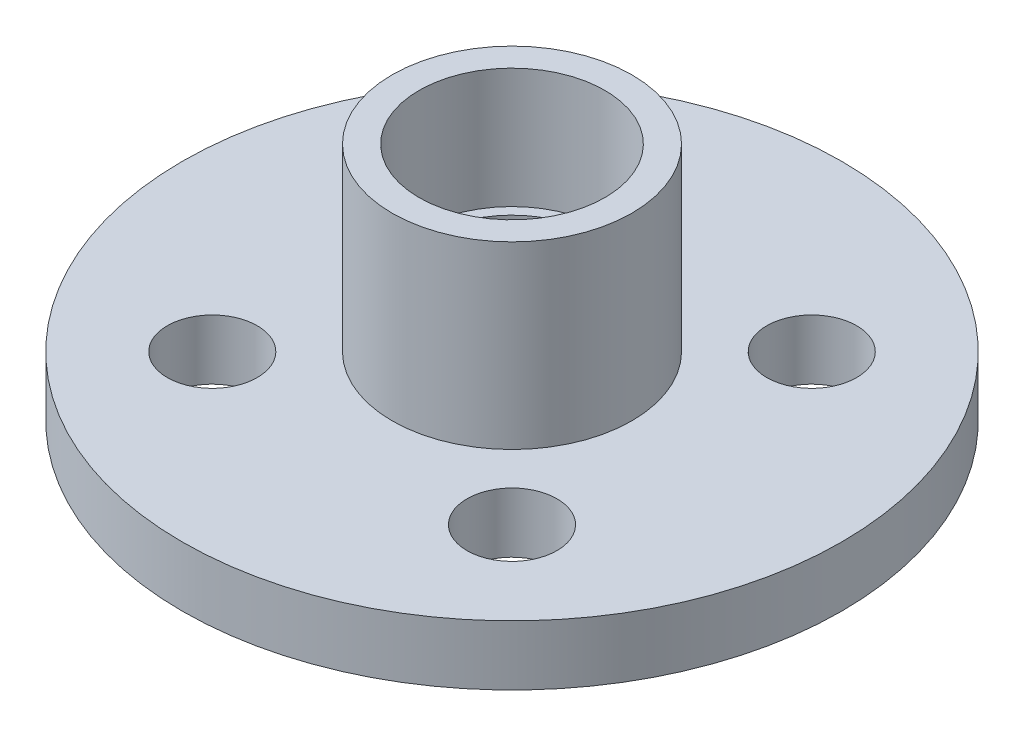
ISO-10303-21;
HEADER;
FILE_DESCRIPTION(('STEP AP214'),'2;1');
FILE_NAME('part.step','',(''),(''),'','','');
FILE_SCHEMA(('AUTOMOTIVE_DESIGN { 1 0 10303 214 1 1 1 1 }'));
ENDSEC;
DATA;
#1=APPLICATION_CONTEXT('core data for automotive mechanical design processes');
#2=APPLICATION_PROTOCOL_DEFINITION('international standard','automotive_design',2000,#1);
#3=PRODUCT_CONTEXT('',#1,'mechanical');
#4=PRODUCT('Part','Part','',(#3));
#5=PRODUCT_RELATED_PRODUCT_CATEGORY('part','',(#4));
#6=PRODUCT_DEFINITION_FORMATION('','',#4);
#7=PRODUCT_DEFINITION_CONTEXT('part definition',#1,'design');
#8=PRODUCT_DEFINITION('design','',#6,#7);
#9=PRODUCT_DEFINITION_SHAPE('','',#8);
#10=(LENGTH_UNIT() NAMED_UNIT(*) SI_UNIT(.MILLI.,.METRE.));
#11=(NAMED_UNIT(*) PLANE_ANGLE_UNIT() SI_UNIT($,.RADIAN.));
#12=(NAMED_UNIT(*) SI_UNIT($,.STERADIAN.) SOLID_ANGLE_UNIT());
#13=UNCERTAINTY_MEASURE_WITH_UNIT(LENGTH_MEASURE(1.E-05),#10,'distance_accuracy_value','');
#14=(GEOMETRIC_REPRESENTATION_CONTEXT(3) GLOBAL_UNCERTAINTY_ASSIGNED_CONTEXT((#13)) GLOBAL_UNIT_ASSIGNED_CONTEXT((#10,
#11,#12)) REPRESENTATION_CONTEXT('',''));
#15=CARTESIAN_POINT('',(0.,0.,0.));
#16=DIRECTION('',(0.,0.,1.));
#17=DIRECTION('',(1.,0.,0.));
#18=AXIS2_PLACEMENT_3D('',#15,#16,#17);
#19=CARTESIAN_POINT('',(0.,2.,0.));
#20=DIRECTION('',(0.,-1.,0.));
#21=DIRECTION('',(0.,0.,-1.));
#22=AXIS2_PLACEMENT_3D('',#19,#20,#21);
#23=CYLINDRICAL_SURFACE('',#22,1.5);
#24=CARTESIAN_POINT('',(0.,0.,0.));
#25=DIRECTION('',(0.,1.,0.));
#26=DIRECTION('',(0.,0.,1.));
#27=AXIS2_PLACEMENT_3D('',#24,#25,#26);
#28=CIRCLE('',#27,1.5);
#29=CARTESIAN_POINT('',(0.,0.,1.5));
#30=VERTEX_POINT('',#29);
#31=EDGE_CURVE('E71',#30,#30,#28,.T.);
#32=ORIENTED_EDGE('',*,*,#31,.F.);
#33=EDGE_LOOP('',(#32));
#34=FACE_BOUND('',#33,.T.);
#35=CARTESIAN_POINT('',(0.,1.,0.));
#36=DIRECTION('',(0.,1.,0.));
#37=DIRECTION('',(0.,0.,1.));
#38=AXIS2_PLACEMENT_3D('',#35,#36,#37);
#39=CIRCLE('',#38,1.5);
#40=CARTESIAN_POINT('',(0.,1.,1.5));
#41=VERTEX_POINT('',#40);
#42=EDGE_CURVE('E45',#41,#41,#39,.T.);
#43=ORIENTED_EDGE('',*,*,#42,.T.);
#44=EDGE_LOOP('',(#43));
#45=FACE_BOUND('',#44,.T.);
#46=ADVANCED_FACE('F41',(#34,#45),#23,.F.);
#47=CARTESIAN_POINT('',(-5.,2.,-5.));
#48=DIRECTION('',(0.,-1.,0.));
#49=DIRECTION('',(0.,0.,-1.));
#50=AXIS2_PLACEMENT_3D('',#47,#48,#49);
#51=CYLINDRICAL_SURFACE('',#50,1.5);
#52=CARTESIAN_POINT('',(-5.,2.,-5.));
#53=DIRECTION('',(0.,1.,0.));
#54=DIRECTION('',(0.,0.,1.));
#55=AXIS2_PLACEMENT_3D('',#52,#53,#54);
#56=CIRCLE('',#55,1.5);
#57=CARTESIAN_POINT('',(-5.,2.,-3.5));
#58=VERTEX_POINT('',#57);
#59=EDGE_CURVE('E49',#58,#58,#56,.T.);
#60=ORIENTED_EDGE('',*,*,#59,.T.);
#61=EDGE_LOOP('',(#60));
#62=FACE_BOUND('',#61,.T.);
#63=CARTESIAN_POINT('',(-5.,0.,-5.));
#64=DIRECTION('',(0.,1.,0.));
#65=DIRECTION('',(0.,0.,1.));
#66=AXIS2_PLACEMENT_3D('',#63,#64,#65);
#67=CIRCLE('',#66,1.5);
#68=CARTESIAN_POINT('',(-5.,0.,-3.5));
#69=VERTEX_POINT('',#68);
#70=EDGE_CURVE('E68',#69,#69,#67,.T.);
#71=ORIENTED_EDGE('',*,*,#70,.F.);
#72=EDGE_LOOP('',(#71));
#73=FACE_BOUND('',#72,.T.);
#74=ADVANCED_FACE('F103',(#62,#73),#51,.F.);
#75=CARTESIAN_POINT('',(-5.00000000000005,2.,4.99999999999995));
#76=DIRECTION('',(0.,-1.,0.));
#77=DIRECTION('',(0.,0.,-1.));
#78=AXIS2_PLACEMENT_3D('',#75,#76,#77);
#79=CYLINDRICAL_SURFACE('',#78,1.5);
#80=CARTESIAN_POINT('',(-5.00000000000005,2.,4.99999999999995));
#81=DIRECTION('',(0.,1.,0.));
#82=DIRECTION('',(0.,0.,1.));
#83=AXIS2_PLACEMENT_3D('',#80,#81,#82);
#84=CIRCLE('',#83,1.5);
#85=CARTESIAN_POINT('',(-5.00000000000005,2.,6.49999999999995));
#86=VERTEX_POINT('',#85);
#87=EDGE_CURVE('E54',#86,#86,#84,.T.);
#88=ORIENTED_EDGE('',*,*,#87,.T.);
#89=EDGE_LOOP('',(#88));
#90=FACE_BOUND('',#89,.T.);
#91=CARTESIAN_POINT('',(-5.00000000000005,0.,4.99999999999995));
#92=DIRECTION('',(0.,1.,0.));
#93=DIRECTION('',(0.,0.,1.));
#94=AXIS2_PLACEMENT_3D('',#91,#92,#93);
#95=CIRCLE('',#94,1.5);
#96=CARTESIAN_POINT('',(-5.00000000000005,0.,6.49999999999995));
#97=VERTEX_POINT('',#96);
#98=EDGE_CURVE('E65',#97,#97,#95,.T.);
#99=ORIENTED_EDGE('',*,*,#98,.F.);
#100=EDGE_LOOP('',(#99));
#101=FACE_BOUND('',#100,.T.);
#102=ADVANCED_FACE('F91',(#90,#101),#79,.F.);
#103=CARTESIAN_POINT('',(5.00000000000002,2.,-4.99999999999998));
#104=DIRECTION('',(0.,-1.,0.));
#105=DIRECTION('',(0.,0.,-1.));
#106=AXIS2_PLACEMENT_3D('',#103,#104,#105);
#107=CYLINDRICAL_SURFACE('',#106,1.5);
#108=CARTESIAN_POINT('',(5.00000000000002,2.,-4.99999999999998));
#109=DIRECTION('',(0.,1.,0.));
#110=DIRECTION('',(0.,0.,1.));
#111=AXIS2_PLACEMENT_3D('',#108,#109,#110);
#112=CIRCLE('',#111,1.5);
#113=CARTESIAN_POINT('',(5.00000000000002,2.,-3.49999999999998));
#114=VERTEX_POINT('',#113);
#115=EDGE_CURVE('E79',#114,#114,#112,.T.);
#116=ORIENTED_EDGE('',*,*,#115,.T.);
#117=EDGE_LOOP('',(#116));
#118=FACE_BOUND('',#117,.T.);
#119=CARTESIAN_POINT('',(5.00000000000002,0.,-4.99999999999998));
#120=DIRECTION('',(0.,1.,0.));
#121=DIRECTION('',(0.,0.,1.));
#122=AXIS2_PLACEMENT_3D('',#119,#120,#121);
#123=CIRCLE('',#122,1.5);
#124=CARTESIAN_POINT('',(5.00000000000002,0.,-3.49999999999998));
#125=VERTEX_POINT('',#124);
#126=EDGE_CURVE('E61',#125,#125,#123,.T.);
#127=ORIENTED_EDGE('',*,*,#126,.F.);
#128=EDGE_LOOP('',(#127));
#129=FACE_BOUND('',#128,.T.);
#130=ADVANCED_FACE('F148',(#118,#129),#107,.F.);
#131=CARTESIAN_POINT('',(4.99999999999997,2.,5.00000000000003));
#132=DIRECTION('',(0.,-1.,0.));
#133=DIRECTION('',(0.,0.,-1.));
#134=AXIS2_PLACEMENT_3D('',#131,#132,#133);
#135=CYLINDRICAL_SURFACE('',#134,1.5);
#136=CARTESIAN_POINT('',(4.99999999999997,2.,5.00000000000003));
#137=DIRECTION('',(0.,1.,0.));
#138=DIRECTION('',(0.,0.,1.));
#139=AXIS2_PLACEMENT_3D('',#136,#137,#138);
#140=CIRCLE('',#139,1.5);
#141=CARTESIAN_POINT('',(4.99999999999997,2.,6.50000000000003));
#142=VERTEX_POINT('',#141);
#143=EDGE_CURVE('E75',#142,#142,#140,.T.);
#144=ORIENTED_EDGE('',*,*,#143,.T.);
#145=EDGE_LOOP('',(#144));
#146=FACE_BOUND('',#145,.T.);
#147=CARTESIAN_POINT('',(4.99999999999997,0.,5.00000000000003));
#148=DIRECTION('',(0.,1.,0.));
#149=DIRECTION('',(0.,0.,1.));
#150=AXIS2_PLACEMENT_3D('',#147,#148,#149);
#151=CIRCLE('',#150,1.5);
#152=CARTESIAN_POINT('',(4.99999999999997,0.,6.50000000000003));
#153=VERTEX_POINT('',#152);
#154=EDGE_CURVE('E58',#153,#153,#151,.T.);
#155=ORIENTED_EDGE('',*,*,#154,.F.);
#156=EDGE_LOOP('',(#155));
#157=FACE_BOUND('',#156,.T.);
#158=ADVANCED_FACE('F43',(#146,#157),#135,.F.);
#159=CARTESIAN_POINT('',(0.,2.,0.));
#160=DIRECTION('',(0.,-1.,0.));
#161=DIRECTION('',(0.,0.,-1.));
#162=AXIS2_PLACEMENT_3D('',#159,#160,#161);
#163=CYLINDRICAL_SURFACE('',#162,11.);
#164=CARTESIAN_POINT('',(0.,2.,0.));
#165=DIRECTION('',(0.,1.,0.));
#166=DIRECTION('',(0.,0.,1.));
#167=AXIS2_PLACEMENT_3D('',#164,#165,#166);
#168=CIRCLE('',#167,11.);
#169=CARTESIAN_POINT('',(0.,2.,11.));
#170=VERTEX_POINT('',#169);
#171=EDGE_CURVE('E10',#170,#170,#168,.T.);
#172=ORIENTED_EDGE('',*,*,#171,.F.);
#173=EDGE_LOOP('',(#172));
#174=FACE_BOUND('',#173,.T.);
#175=CARTESIAN_POINT('',(0.,0.,0.));
#176=DIRECTION('',(0.,1.,0.));
#177=DIRECTION('',(0.,0.,1.));
#178=AXIS2_PLACEMENT_3D('',#175,#176,#177);
#179=CIRCLE('',#178,11.);
#180=CARTESIAN_POINT('',(0.,0.,11.));
#181=VERTEX_POINT('',#180);
#182=EDGE_CURVE('E73',#181,#181,#179,.T.);
#183=ORIENTED_EDGE('',*,*,#182,.T.);
#184=EDGE_LOOP('',(#183));
#185=FACE_BOUND('',#184,.T.);
#186=ADVANCED_FACE('F98',(#174,#185),#163,.T.);
#187=CARTESIAN_POINT('',(0.,2.,0.));
#188=DIRECTION('',(0.,1.,0.));
#189=DIRECTION('',(0.,0.,1.));
#190=AXIS2_PLACEMENT_3D('',#187,#188,#189);
#191=PLANE('',#190);
#192=CARTESIAN_POINT('',(0.,2.,0.));
#193=DIRECTION('',(0.,1.,0.));
#194=DIRECTION('',(0.,0.,1.));
#195=AXIS2_PLACEMENT_3D('',#192,#193,#194);
#196=CIRCLE('',#195,4.);
#197=CARTESIAN_POINT('',(0.,2.,4.));
#198=VERTEX_POINT('',#197);
#199=EDGE_CURVE('E86',#198,#198,#196,.T.);
#200=ORIENTED_EDGE('',*,*,#199,.F.);
#201=EDGE_LOOP('',(#200));
#202=FACE_BOUND('',#201,.T.);
#203=ORIENTED_EDGE('',*,*,#143,.F.);
#204=EDGE_LOOP('',(#203));
#205=FACE_BOUND('',#204,.T.);
#206=ORIENTED_EDGE('',*,*,#115,.F.);
#207=EDGE_LOOP('',(#206));
#208=FACE_BOUND('',#207,.T.);
#209=ORIENTED_EDGE('',*,*,#87,.F.);
#210=EDGE_LOOP('',(#209));
#211=FACE_BOUND('',#210,.T.);
#212=ORIENTED_EDGE('',*,*,#59,.F.);
#213=EDGE_LOOP('',(#212));
#214=FACE_BOUND('',#213,.T.);
#215=ORIENTED_EDGE('',*,*,#171,.T.);
#216=EDGE_LOOP('',(#215));
#217=FACE_BOUND('',#216,.T.);
#218=ADVANCED_FACE('F94',(#202,#205,#208,#211,#214,#217),#191,.T.);
#219=CARTESIAN_POINT('',(0.,0.,0.));
#220=DIRECTION('',(0.,1.,0.));
#221=DIRECTION('',(0.,0.,1.));
#222=AXIS2_PLACEMENT_3D('',#219,#220,#221);
#223=PLANE('',#222);
#224=ORIENTED_EDGE('',*,*,#154,.T.);
#225=EDGE_LOOP('',(#224));
#226=FACE_BOUND('',#225,.T.);
#227=ORIENTED_EDGE('',*,*,#126,.T.);
#228=EDGE_LOOP('',(#227));
#229=FACE_BOUND('',#228,.T.);
#230=ORIENTED_EDGE('',*,*,#98,.T.);
#231=EDGE_LOOP('',(#230));
#232=FACE_BOUND('',#231,.T.);
#233=ORIENTED_EDGE('',*,*,#70,.T.);
#234=EDGE_LOOP('',(#233));
#235=FACE_BOUND('',#234,.T.);
#236=ORIENTED_EDGE('',*,*,#31,.T.);
#237=EDGE_LOOP('',(#236));
#238=FACE_BOUND('',#237,.T.);
#239=ORIENTED_EDGE('',*,*,#182,.F.);
#240=EDGE_LOOP('',(#239));
#241=FACE_BOUND('',#240,.T.);
#242=ADVANCED_FACE('F97',(#226,#229,#232,#235,#238,#241),#223,.F.);
#243=CARTESIAN_POINT('',(0.,8.,0.));
#244=DIRECTION('',(0.,1.,0.));
#245=DIRECTION('',(0.,0.,1.));
#246=AXIS2_PLACEMENT_3D('',#243,#244,#245);
#247=PLANE('',#246);
#248=CARTESIAN_POINT('',(0.,8.,0.));
#249=DIRECTION('',(0.,1.,0.));
#250=DIRECTION('',(0.,0.,1.));
#251=AXIS2_PLACEMENT_3D('',#248,#249,#250);
#252=CIRCLE('',#251,3.1);
#253=CARTESIAN_POINT('',(0.,8.,3.1));
#254=VERTEX_POINT('',#253);
#255=EDGE_CURVE('E123',#254,#254,#252,.T.);
#256=ORIENTED_EDGE('',*,*,#255,.F.);
#257=EDGE_LOOP('',(#256));
#258=FACE_BOUND('',#257,.T.);
#259=CARTESIAN_POINT('',(0.,8.,0.));
#260=DIRECTION('',(0.,1.,0.));
#261=DIRECTION('',(0.,0.,1.));
#262=AXIS2_PLACEMENT_3D('',#259,#260,#261);
#263=CIRCLE('',#262,4.);
#264=CARTESIAN_POINT('',(0.,8.,4.));
#265=VERTEX_POINT('',#264);
#266=EDGE_CURVE('E62',#265,#265,#263,.T.);
#267=ORIENTED_EDGE('',*,*,#266,.T.);
#268=EDGE_LOOP('',(#267));
#269=FACE_BOUND('',#268,.T.);
#270=ADVANCED_FACE('F111',(#258,#269),#247,.T.);
#271=CARTESIAN_POINT('',(0.,8.,0.));
#272=DIRECTION('',(0.,-1.,0.));
#273=DIRECTION('',(0.,0.,-1.));
#274=AXIS2_PLACEMENT_3D('',#271,#272,#273);
#275=CYLINDRICAL_SURFACE('',#274,4.);
#276=ORIENTED_EDGE('',*,*,#266,.F.);
#277=EDGE_LOOP('',(#276));
#278=FACE_BOUND('',#277,.T.);
#279=ORIENTED_EDGE('',*,*,#199,.T.);
#280=EDGE_LOOP('',(#279));
#281=FACE_BOUND('',#280,.T.);
#282=ADVANCED_FACE('F143',(#278,#281),#275,.T.);
#283=CARTESIAN_POINT('',(0.,4.,0.));
#284=DIRECTION('',(0.,1.,0.));
#285=DIRECTION('',(0.,0.,1.));
#286=AXIS2_PLACEMENT_3D('',#283,#284,#285);
#287=CYLINDRICAL_SURFACE('',#286,3.1);
#288=CARTESIAN_POINT('',(0.,4.,0.));
#289=DIRECTION('',(0.,1.,0.));
#290=DIRECTION('',(0.,0.,1.));
#291=AXIS2_PLACEMENT_3D('',#288,#289,#290);
#292=CIRCLE('',#291,3.1);
#293=CARTESIAN_POINT('',(0.,4.,3.1));
#294=VERTEX_POINT('',#293);
#295=EDGE_CURVE('E126',#294,#294,#292,.T.);
#296=ORIENTED_EDGE('',*,*,#295,.F.);
#297=EDGE_LOOP('',(#296));
#298=FACE_BOUND('',#297,.T.);
#299=ORIENTED_EDGE('',*,*,#255,.T.);
#300=EDGE_LOOP('',(#299));
#301=FACE_BOUND('',#300,.T.);
#302=ADVANCED_FACE('F165',(#298,#301),#287,.F.);
#303=CARTESIAN_POINT('',(0.,4.,0.));
#304=DIRECTION('',(0.,1.,0.));
#305=DIRECTION('',(0.,0.,1.));
#306=AXIS2_PLACEMENT_3D('',#303,#304,#305);
#307=PLANE('',#306);
#308=CARTESIAN_POINT('',(0.,4.,0.));
#309=DIRECTION('',(0.,1.,0.));
#310=DIRECTION('',(0.,0.,1.));
#311=AXIS2_PLACEMENT_3D('',#308,#309,#310);
#312=CIRCLE('',#311,2.75);
#313=CARTESIAN_POINT('',(0.,4.,2.75));
#314=VERTEX_POINT('',#313);
#315=EDGE_CURVE('E129',#314,#314,#312,.T.);
#316=ORIENTED_EDGE('',*,*,#315,.F.);
#317=EDGE_LOOP('',(#316));
#318=FACE_BOUND('',#317,.T.);
#319=ORIENTED_EDGE('',*,*,#295,.T.);
#320=EDGE_LOOP('',(#319));
#321=FACE_BOUND('',#320,.T.);
#322=ADVANCED_FACE('F172',(#318,#321),#307,.T.);
#323=CARTESIAN_POINT('',(0.,1.,0.));
#324=DIRECTION('',(0.,1.,0.));
#325=DIRECTION('',(0.,0.,1.));
#326=AXIS2_PLACEMENT_3D('',#323,#324,#325);
#327=CYLINDRICAL_SURFACE('',#326,2.75);
#328=CARTESIAN_POINT('',(0.,1.,0.));
#329=DIRECTION('',(0.,1.,0.));
#330=DIRECTION('',(0.,0.,1.));
#331=AXIS2_PLACEMENT_3D('',#328,#329,#330);
#332=CIRCLE('',#331,2.75);
#333=CARTESIAN_POINT('',(0.,1.,2.75));
#334=VERTEX_POINT('',#333);
#335=EDGE_CURVE('E124',#334,#334,#332,.T.);
#336=ORIENTED_EDGE('',*,*,#335,.F.);
#337=EDGE_LOOP('',(#336));
#338=FACE_BOUND('',#337,.T.);
#339=ORIENTED_EDGE('',*,*,#315,.T.);
#340=EDGE_LOOP('',(#339));
#341=FACE_BOUND('',#340,.T.);
#342=ADVANCED_FACE('F176',(#338,#341),#327,.F.);
#343=CARTESIAN_POINT('',(0.,1.,0.));
#344=DIRECTION('',(0.,1.,0.));
#345=DIRECTION('',(0.,0.,1.));
#346=AXIS2_PLACEMENT_3D('',#343,#344,#345);
#347=PLANE('',#346);
#348=ORIENTED_EDGE('',*,*,#42,.F.);
#349=EDGE_LOOP('',(#348));
#350=FACE_BOUND('',#349,.T.);
#351=ORIENTED_EDGE('',*,*,#335,.T.);
#352=EDGE_LOOP('',(#351));
#353=FACE_BOUND('',#352,.T.);
#354=ADVANCED_FACE('F180',(#350,#353),#347,.T.);
#355=CLOSED_SHELL('',(#46,#74,#102,#130,#158,#186,#218,#242,#270,#282,#302,#322,#342,#354));
#356=MANIFOLD_SOLID_BREP('B2',#355);
#357=ADVANCED_BREP_SHAPE_REPRESENTATION('',(#18,#356),#14);
#358=SHAPE_DEFINITION_REPRESENTATION(#9,#357);
ENDSEC;
END-ISO-10303-21;
